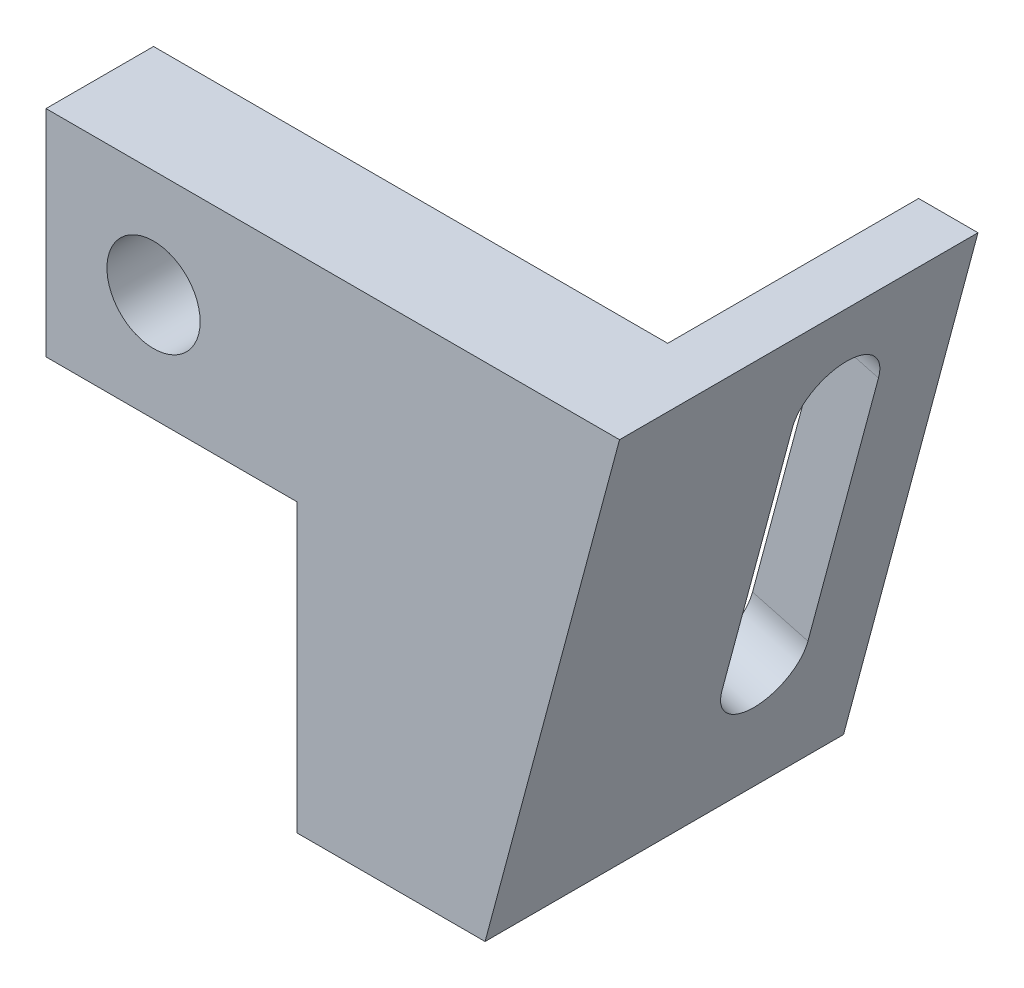
ISO-10303-21;
HEADER;
FILE_DESCRIPTION(('STEP AP214'),'2;1');
FILE_NAME('part.step','',(''),(''),'','','');
FILE_SCHEMA(('AUTOMOTIVE_DESIGN { 1 0 10303 214 1 1 1 1 }'));
ENDSEC;
DATA;
#1=APPLICATION_CONTEXT('core data for automotive mechanical design processes');
#2=APPLICATION_PROTOCOL_DEFINITION('international standard','automotive_design',2000,#1);
#3=PRODUCT_CONTEXT('',#1,'mechanical');
#4=PRODUCT('Part','Part','',(#3));
#5=PRODUCT_RELATED_PRODUCT_CATEGORY('part','',(#4));
#6=PRODUCT_DEFINITION_FORMATION('','',#4);
#7=PRODUCT_DEFINITION_CONTEXT('part definition',#1,'design');
#8=PRODUCT_DEFINITION('design','',#6,#7);
#9=PRODUCT_DEFINITION_SHAPE('','',#8);
#10=(LENGTH_UNIT() NAMED_UNIT(*) SI_UNIT(.MILLI.,.METRE.));
#11=(NAMED_UNIT(*) PLANE_ANGLE_UNIT() SI_UNIT($,.RADIAN.));
#12=(NAMED_UNIT(*) SI_UNIT($,.STERADIAN.) SOLID_ANGLE_UNIT());
#13=UNCERTAINTY_MEASURE_WITH_UNIT(LENGTH_MEASURE(1.E-05),#10,'distance_accuracy_value','');
#14=(GEOMETRIC_REPRESENTATION_CONTEXT(3) GLOBAL_UNCERTAINTY_ASSIGNED_CONTEXT((#13)) GLOBAL_UNIT_ASSIGNED_CONTEXT((#10,
#11,#12)) REPRESENTATION_CONTEXT('',''));
#15=CARTESIAN_POINT('',(0.,0.,0.));
#16=DIRECTION('',(0.,0.,1.));
#17=DIRECTION('',(1.,0.,0.));
#18=AXIS2_PLACEMENT_3D('',#15,#16,#17);
#19=CARTESIAN_POINT('',(0.,0.,0.));
#20=DIRECTION('',(0.,0.,1.));
#21=DIRECTION('',(1.,0.,0.));
#22=AXIS2_PLACEMENT_3D('',#19,#20,#21);
#23=PLANE('',#22);
#24=CARTESIAN_POINT('',(-96.6168499055209,31.5709484780107,0.));
#25=DIRECTION('',(0.,0.,1.));
#26=DIRECTION('',(1.,0.,0.));
#27=AXIS2_PLACEMENT_3D('',#24,#25,#26);
#28=CIRCLE('',#27,6.5);
#29=CARTESIAN_POINT('',(-90.1168499055209,31.5709484780107,0.));
#30=VERTEX_POINT('',#29);
#31=EDGE_CURVE('E203',#30,#30,#28,.T.);
#32=ORIENTED_EDGE('',*,*,#31,.T.);
#33=EDGE_LOOP('',(#32));
#34=FACE_BOUND('',#33,.T.);
#35=DIRECTION('',(0.258819045102525,0.965925826289067,0.));
#36=VECTOR('',#35,1.);
#37=CARTESIAN_POINT('',(-58.6555028189805,-23.4290515219893,0.));
#38=LINE('',#37,#36);
#39=CARTESIAN_POINT('',(-58.6555028189805,-23.4290515219893,0.));
#40=VERTEX_POINT('',#39);
#41=CARTESIAN_POINT('',(-39.8990593488016,46.5709484780107,0.));
#42=VERTEX_POINT('',#41);
#43=EDGE_CURVE('E145',#40,#42,#38,.T.);
#44=ORIENTED_EDGE('',*,*,#43,.F.);
#45=DIRECTION('',(1.,0.,0.));
#46=VECTOR('',#45,1.);
#47=CARTESIAN_POINT('',(-50.3732933756998,-23.4290515219893,0.));
#48=LINE('',#47,#46);
#49=CARTESIAN_POINT('',(-76.6168499055209,-23.4290515219893,0.));
#50=VERTEX_POINT('',#49);
#51=EDGE_CURVE('E217',#50,#40,#48,.T.);
#52=ORIENTED_EDGE('',*,*,#51,.F.);
#53=DIRECTION('',(0.,-1.,0.));
#54=VECTOR('',#53,1.);
#55=CARTESIAN_POINT('',(-76.6168499055209,-23.4290515219893,0.));
#56=LINE('',#55,#54);
#57=CARTESIAN_POINT('',(-76.6168499055209,16.5709484780107,0.));
#58=VERTEX_POINT('',#57);
#59=EDGE_CURVE('E241',#58,#50,#56,.T.);
#60=ORIENTED_EDGE('',*,*,#59,.F.);
#61=DIRECTION('',(1.,0.,0.));
#62=VECTOR('',#61,1.);
#63=CARTESIAN_POINT('',(-76.6168499055209,16.5709484780107,0.));
#64=LINE('',#63,#62);
#65=CARTESIAN_POINT('',(-111.616849905521,16.5709484780107,0.));
#66=VERTEX_POINT('',#65);
#67=EDGE_CURVE('E238',#66,#58,#64,.T.);
#68=ORIENTED_EDGE('',*,*,#67,.F.);
#69=DIRECTION('',(0.,-1.,0.));
#70=VECTOR('',#69,1.);
#71=CARTESIAN_POINT('',(-111.616849905521,16.5709484780107,0.));
#72=LINE('',#71,#70);
#73=CARTESIAN_POINT('',(-111.616849905521,46.5709484780107,0.));
#74=VERTEX_POINT('',#73);
#75=EDGE_CURVE('E235',#74,#66,#72,.T.);
#76=ORIENTED_EDGE('',*,*,#75,.F.);
#77=DIRECTION('',(-1.,0.,0.));
#78=VECTOR('',#77,1.);
#79=CARTESIAN_POINT('',(-111.616849905521,46.5709484780107,0.));
#80=LINE('',#79,#78);
#81=EDGE_CURVE('E208',#42,#74,#80,.T.);
#82=ORIENTED_EDGE('',*,*,#81,.F.);
#83=EDGE_LOOP('',(#44,#52,#60,#68,#76,#82));
#84=FACE_BOUND('',#83,.T.);
#85=ADVANCED_FACE('F39',(#34,#84),#23,.F.);
#86=CARTESIAN_POINT('',(0.,0.,15.));
#87=DIRECTION('',(0.,0.,1.));
#88=DIRECTION('',(1.,0.,0.));
#89=AXIS2_PLACEMENT_3D('',#86,#87,#88);
#90=PLANE('',#89);
#91=DIRECTION('',(-1.,0.,0.));
#92=VECTOR('',#91,1.);
#93=CARTESIAN_POINT('',(-111.616849905521,46.5709484780107,15.));
#94=LINE('',#93,#92);
#95=CARTESIAN_POINT('',(-31.6168499055209,46.5709484780107,15.));
#96=VERTEX_POINT('',#95);
#97=CARTESIAN_POINT('',(-111.616849905521,46.5709484780107,15.));
#98=VERTEX_POINT('',#97);
#99=EDGE_CURVE('E212',#96,#98,#94,.T.);
#100=ORIENTED_EDGE('',*,*,#99,.T.);
#101=DIRECTION('',(0.,-1.,0.));
#102=VECTOR('',#101,1.);
#103=CARTESIAN_POINT('',(-111.616849905521,16.5709484780107,15.));
#104=LINE('',#103,#102);
#105=CARTESIAN_POINT('',(-111.616849905521,16.5709484780107,15.));
#106=VERTEX_POINT('',#105);
#107=EDGE_CURVE('E216',#98,#106,#104,.T.);
#108=ORIENTED_EDGE('',*,*,#107,.T.);
#109=DIRECTION('',(1.,0.,0.));
#110=VECTOR('',#109,1.);
#111=CARTESIAN_POINT('',(-76.6168499055209,16.5709484780107,15.));
#112=LINE('',#111,#110);
#113=CARTESIAN_POINT('',(-76.6168499055209,16.5709484780107,15.));
#114=VERTEX_POINT('',#113);
#115=EDGE_CURVE('E220',#106,#114,#112,.T.);
#116=ORIENTED_EDGE('',*,*,#115,.T.);
#117=DIRECTION('',(0.,-1.,0.));
#118=VECTOR('',#117,1.);
#119=CARTESIAN_POINT('',(-76.6168499055209,-23.4290515219893,15.));
#120=LINE('',#119,#118);
#121=CARTESIAN_POINT('',(-76.6168499055209,-23.4290515219893,15.));
#122=VERTEX_POINT('',#121);
#123=EDGE_CURVE('E223',#114,#122,#120,.T.);
#124=ORIENTED_EDGE('',*,*,#123,.T.);
#125=DIRECTION('',(1.,0.,0.));
#126=VECTOR('',#125,1.);
#127=CARTESIAN_POINT('',(-50.3732933756998,-23.4290515219893,15.));
#128=LINE('',#127,#126);
#129=CARTESIAN_POINT('',(-50.3732933756998,-23.4290515219893,15.));
#130=VERTEX_POINT('',#129);
#131=EDGE_CURVE('E226',#122,#130,#128,.T.);
#132=ORIENTED_EDGE('',*,*,#131,.T.);
#133=DIRECTION('',(0.258819045102525,0.965925826289067,0.));
#134=VECTOR('',#133,1.);
#135=CARTESIAN_POINT('',(-31.6168499055209,46.5709484780107,15.));
#136=LINE('',#135,#134);
#137=EDGE_CURVE('E229',#130,#96,#136,.T.);
#138=ORIENTED_EDGE('',*,*,#137,.T.);
#139=EDGE_LOOP('',(#100,#108,#116,#124,#132,#138));
#140=FACE_BOUND('',#139,.T.);
#141=CARTESIAN_POINT('',(-96.6168499055209,31.5709484780107,15.));
#142=DIRECTION('',(0.,0.,1.));
#143=DIRECTION('',(1.,0.,0.));
#144=AXIS2_PLACEMENT_3D('',#141,#142,#143);
#145=CIRCLE('',#144,6.5);
#146=CARTESIAN_POINT('',(-90.1168499055209,31.5709484780107,15.));
#147=VERTEX_POINT('',#146);
#148=EDGE_CURVE('E204',#147,#147,#145,.T.);
#149=ORIENTED_EDGE('',*,*,#148,.F.);
#150=EDGE_LOOP('',(#149));
#151=FACE_BOUND('',#150,.T.);
#152=ADVANCED_FACE('F284',(#140,#151),#90,.T.);
#153=CARTESIAN_POINT('',(-111.616849905521,46.5709484780107,15.));
#154=DIRECTION('',(0.,-1.,0.));
#155=DIRECTION('',(0.,0.,-1.));
#156=AXIS2_PLACEMENT_3D('',#153,#154,#155);
#157=PLANE('',#156);
#158=DIRECTION('',(0.,0.,-1.));
#159=VECTOR('',#158,1.);
#160=CARTESIAN_POINT('',(-31.6168499055209,46.5709484780107,15.));
#161=LINE('',#160,#159);
#162=CARTESIAN_POINT('',(-31.6168499055209,46.5709484780107,-35.));
#163=VERTEX_POINT('',#162);
#164=EDGE_CURVE('E232',#96,#163,#161,.T.);
#165=ORIENTED_EDGE('',*,*,#164,.T.);
#166=DIRECTION('',(1.,0.,0.));
#167=VECTOR('',#166,1.);
#168=CARTESIAN_POINT('',(-39.8990593488016,46.5709484780107,-35.));
#169=LINE('',#168,#167);
#170=CARTESIAN_POINT('',(-39.8990593488016,46.5709484780107,-35.));
#171=VERTEX_POINT('',#170);
#172=EDGE_CURVE('E184',#171,#163,#169,.T.);
#173=ORIENTED_EDGE('',*,*,#172,.F.);
#174=DIRECTION('',(0.,0.,1.));
#175=VECTOR('',#174,1.);
#176=CARTESIAN_POINT('',(-39.8990593488016,46.5709484780107,-35.));
#177=LINE('',#176,#175);
#178=EDGE_CURVE('E192',#171,#42,#177,.T.);
#179=ORIENTED_EDGE('',*,*,#178,.T.);
#180=ORIENTED_EDGE('',*,*,#81,.T.);
#181=DIRECTION('',(0.,0.,-1.));
#182=VECTOR('',#181,1.);
#183=CARTESIAN_POINT('',(-111.616849905521,46.5709484780107,15.));
#184=LINE('',#183,#182);
#185=EDGE_CURVE('E11',#98,#74,#184,.T.);
#186=ORIENTED_EDGE('',*,*,#185,.F.);
#187=ORIENTED_EDGE('',*,*,#99,.F.);
#188=EDGE_LOOP('',(#165,#173,#179,#180,#186,#187));
#189=FACE_BOUND('',#188,.T.);
#190=ADVANCED_FACE('F41',(#189),#157,.F.);
#191=CARTESIAN_POINT('',(-111.616849905521,16.5709484780107,15.));
#192=DIRECTION('',(1.,0.,0.));
#193=DIRECTION('',(0.,1.,0.));
#194=AXIS2_PLACEMENT_3D('',#191,#192,#193);
#195=PLANE('',#194);
#196=ORIENTED_EDGE('',*,*,#75,.T.);
#197=DIRECTION('',(0.,0.,-1.));
#198=VECTOR('',#197,1.);
#199=CARTESIAN_POINT('',(-111.616849905521,16.5709484780107,15.));
#200=LINE('',#199,#198);
#201=EDGE_CURVE('E48',#106,#66,#200,.T.);
#202=ORIENTED_EDGE('',*,*,#201,.F.);
#203=ORIENTED_EDGE('',*,*,#107,.F.);
#204=ORIENTED_EDGE('',*,*,#185,.T.);
#205=EDGE_LOOP('',(#196,#202,#203,#204));
#206=FACE_BOUND('',#205,.T.);
#207=ADVANCED_FACE('F289',(#206),#195,.F.);
#208=CARTESIAN_POINT('',(-76.6168499055209,16.5709484780107,15.));
#209=DIRECTION('',(0.,1.,0.));
#210=DIRECTION('',(-1.,0.,0.));
#211=AXIS2_PLACEMENT_3D('',#208,#209,#210);
#212=PLANE('',#211);
#213=ORIENTED_EDGE('',*,*,#67,.T.);
#214=DIRECTION('',(0.,0.,-1.));
#215=VECTOR('',#214,1.);
#216=CARTESIAN_POINT('',(-76.6168499055209,16.5709484780107,15.));
#217=LINE('',#216,#215);
#218=EDGE_CURVE('E256',#114,#58,#217,.T.);
#219=ORIENTED_EDGE('',*,*,#218,.F.);
#220=ORIENTED_EDGE('',*,*,#115,.F.);
#221=ORIENTED_EDGE('',*,*,#201,.T.);
#222=EDGE_LOOP('',(#213,#219,#220,#221));
#223=FACE_BOUND('',#222,.T.);
#224=ADVANCED_FACE('F265',(#223),#212,.F.);
#225=CARTESIAN_POINT('',(-76.6168499055209,-23.4290515219893,15.));
#226=DIRECTION('',(1.,0.,0.));
#227=DIRECTION('',(0.,0.,-1.));
#228=AXIS2_PLACEMENT_3D('',#225,#226,#227);
#229=PLANE('',#228);
#230=ORIENTED_EDGE('',*,*,#59,.T.);
#231=DIRECTION('',(0.,0.,-1.));
#232=VECTOR('',#231,1.);
#233=CARTESIAN_POINT('',(-76.6168499055209,-23.4290515219893,15.));
#234=LINE('',#233,#232);
#235=EDGE_CURVE('E252',#122,#50,#234,.T.);
#236=ORIENTED_EDGE('',*,*,#235,.F.);
#237=ORIENTED_EDGE('',*,*,#123,.F.);
#238=ORIENTED_EDGE('',*,*,#218,.T.);
#239=EDGE_LOOP('',(#230,#236,#237,#238));
#240=FACE_BOUND('',#239,.T.);
#241=ADVANCED_FACE('F274',(#240),#229,.F.);
#242=CARTESIAN_POINT('',(-50.3732933756998,-23.4290515219893,15.));
#243=DIRECTION('',(0.,1.,0.));
#244=DIRECTION('',(-1.,0.,0.));
#245=AXIS2_PLACEMENT_3D('',#242,#243,#244);
#246=PLANE('',#245);
#247=ORIENTED_EDGE('',*,*,#51,.T.);
#248=DIRECTION('',(0.,0.,1.));
#249=VECTOR('',#248,1.);
#250=CARTESIAN_POINT('',(-58.6555028189805,-23.4290515219893,-35.));
#251=LINE('',#250,#249);
#252=CARTESIAN_POINT('',(-58.6555028189805,-23.4290515219893,-35.));
#253=VERTEX_POINT('',#252);
#254=EDGE_CURVE('E199',#253,#40,#251,.T.);
#255=ORIENTED_EDGE('',*,*,#254,.F.);
#256=DIRECTION('',(-1.,0.,0.));
#257=VECTOR('',#256,1.);
#258=CARTESIAN_POINT('',(-50.3732933756998,-23.4290515219893,-35.));
#259=LINE('',#258,#257);
#260=CARTESIAN_POINT('',(-50.3732933756998,-23.4290515219893,-35.));
#261=VERTEX_POINT('',#260);
#262=EDGE_CURVE('E177',#261,#253,#259,.T.);
#263=ORIENTED_EDGE('',*,*,#262,.F.);
#264=DIRECTION('',(0.,0.,-1.));
#265=VECTOR('',#264,1.);
#266=CARTESIAN_POINT('',(-50.3732933756998,-23.4290515219893,15.));
#267=LINE('',#266,#265);
#268=EDGE_CURVE('E249',#130,#261,#267,.T.);
#269=ORIENTED_EDGE('',*,*,#268,.F.);
#270=ORIENTED_EDGE('',*,*,#131,.F.);
#271=ORIENTED_EDGE('',*,*,#235,.T.);
#272=EDGE_LOOP('',(#247,#255,#263,#269,#270,#271));
#273=FACE_BOUND('',#272,.T.);
#274=ADVANCED_FACE('F278',(#273),#246,.F.);
#275=CARTESIAN_POINT('',(-31.6168499055209,46.5709484780107,15.));
#276=DIRECTION('',(-0.965925826289067,0.258819045102525,0.));
#277=DIRECTION('',(-0.258819045102525,-0.965925826289067,0.));
#278=AXIS2_PLACEMENT_3D('',#275,#276,#277);
#279=PLANE('',#278);
#280=DIRECTION('',(-0.258819045102525,-0.965925826289067,0.));
#281=VECTOR('',#280,1.);
#282=CARTESIAN_POINT('',(-35.4991355820588,32.0820610836747,-13.));
#283=LINE('',#282,#281);
#284=CARTESIAN_POINT('',(-35.4991355820588,32.0820610836747,-13.));
#285=VERTEX_POINT('',#284);
#286=CARTESIAN_POINT('',(-45.3342592959548,-4.62312031530984,-13.));
#287=VERTEX_POINT('',#286);
#288=EDGE_CURVE('E156',#285,#287,#283,.T.);
#289=ORIENTED_EDGE('',*,*,#288,.F.);
#290=CARTESIAN_POINT('',(-35.4991355820588,32.0820610836747,-19.));
#291=DIRECTION('',(0.965925826289067,-0.258819045102525,0.));
#292=DIRECTION('',(0.258819045102525,0.965925826289067,0.));
#293=AXIS2_PLACEMENT_3D('',#290,#291,#292);
#294=CIRCLE('',#293,6.);
#295=CARTESIAN_POINT('',(-35.4991355820588,32.0820610836747,-25.));
#296=VERTEX_POINT('',#295);
#297=EDGE_CURVE('E55',#296,#285,#294,.T.);
#298=ORIENTED_EDGE('',*,*,#297,.F.);
#299=DIRECTION('',(0.258819045102525,0.965925826289067,0.));
#300=VECTOR('',#299,1.);
#301=CARTESIAN_POINT('',(-35.4991355820588,32.0820610836747,-25.));
#302=LINE('',#301,#300);
#303=CARTESIAN_POINT('',(-45.3342592959548,-4.62312031530984,-25.));
#304=VERTEX_POINT('',#303);
#305=EDGE_CURVE('E138',#304,#296,#302,.T.);
#306=ORIENTED_EDGE('',*,*,#305,.F.);
#307=CARTESIAN_POINT('',(-45.3342592959548,-4.62312031530984,-19.));
#308=DIRECTION('',(0.965925826289067,-0.258819045102525,0.));
#309=DIRECTION('',(0.258819045102525,0.965925826289067,0.));
#310=AXIS2_PLACEMENT_3D('',#307,#308,#309);
#311=CIRCLE('',#310,6.);
#312=EDGE_CURVE('E163',#287,#304,#311,.T.);
#313=ORIENTED_EDGE('',*,*,#312,.F.);
#314=EDGE_LOOP('',(#289,#298,#306,#313));
#315=FACE_BOUND('',#314,.T.);
#316=ORIENTED_EDGE('',*,*,#268,.T.);
#317=DIRECTION('',(-0.258819045102525,-0.965925826289067,0.));
#318=VECTOR('',#317,1.);
#319=CARTESIAN_POINT('',(-31.6168499055209,46.5709484780107,-35.));
#320=LINE('',#319,#318);
#321=EDGE_CURVE('E188',#163,#261,#320,.T.);
#322=ORIENTED_EDGE('',*,*,#321,.F.);
#323=ORIENTED_EDGE('',*,*,#164,.F.);
#324=ORIENTED_EDGE('',*,*,#137,.F.);
#325=EDGE_LOOP('',(#316,#322,#323,#324));
#326=FACE_BOUND('',#325,.T.);
#327=ADVANCED_FACE('F297',(#315,#326),#279,.F.);
#328=CARTESIAN_POINT('',(-96.6168499055209,31.5709484780107,15.));
#329=DIRECTION('',(0.,0.,-1.));
#330=DIRECTION('',(-1.,0.,0.));
#331=AXIS2_PLACEMENT_3D('',#328,#329,#330);
#332=CYLINDRICAL_SURFACE('',#331,6.5);
#333=ORIENTED_EDGE('',*,*,#148,.T.);
#334=EDGE_LOOP('',(#333));
#335=FACE_BOUND('',#334,.T.);
#336=ORIENTED_EDGE('',*,*,#31,.F.);
#337=EDGE_LOOP('',(#336));
#338=FACE_BOUND('',#337,.T.);
#339=ADVANCED_FACE('F299',(#335,#338),#332,.F.);
#340=CARTESIAN_POINT('',(-58.6555028189805,-23.4290515219893,-35.));
#341=DIRECTION('',(0.965925826289067,-0.258819045102525,0.));
#342=DIRECTION('',(0.258819045102525,0.965925826289067,0.));
#343=AXIS2_PLACEMENT_3D('',#340,#341,#342);
#344=PLANE('',#343);
#345=DIRECTION('',(-0.258819045102525,-0.965925826289067,0.));
#346=VECTOR('',#345,1.);
#347=CARTESIAN_POINT('',(-43.2265421923713,34.1526134444949,-25.));
#348=LINE('',#347,#346);
#349=CARTESIAN_POINT('',(-43.2265421923713,34.1526134444949,-25.));
#350=VERTEX_POINT('',#349);
#351=CARTESIAN_POINT('',(-53.0616659062673,-2.55256795448965,-25.));
#352=VERTEX_POINT('',#351);
#353=EDGE_CURVE('E151',#350,#352,#348,.T.);
#354=ORIENTED_EDGE('',*,*,#353,.F.);
#355=CARTESIAN_POINT('',(-43.2265421923713,34.1526134444949,-19.));
#356=DIRECTION('',(0.965925826289067,-0.258819045102525,0.));
#357=DIRECTION('',(0.258819045102525,0.965925826289067,0.));
#358=AXIS2_PLACEMENT_3D('',#355,#356,#357);
#359=CIRCLE('',#358,6.);
#360=CARTESIAN_POINT('',(-43.2265421923713,34.1526134444949,-13.));
#361=VERTEX_POINT('',#360);
#362=EDGE_CURVE('E131',#361,#350,#359,.F.);
#363=ORIENTED_EDGE('',*,*,#362,.F.);
#364=DIRECTION('',(0.258819045102525,0.965925826289067,0.));
#365=VECTOR('',#364,1.);
#366=CARTESIAN_POINT('',(-43.2265421923713,34.1526134444949,-13.));
#367=LINE('',#366,#365);
#368=CARTESIAN_POINT('',(-53.0616659062673,-2.55256795448963,-13.));
#369=VERTEX_POINT('',#368);
#370=EDGE_CURVE('E141',#369,#361,#367,.T.);
#371=ORIENTED_EDGE('',*,*,#370,.F.);
#372=CARTESIAN_POINT('',(-53.0616659062673,-2.55256795448965,-19.));
#373=DIRECTION('',(0.965925826289067,-0.258819045102525,0.));
#374=DIRECTION('',(0.258819045102525,0.965925826289067,0.));
#375=AXIS2_PLACEMENT_3D('',#372,#373,#374);
#376=CIRCLE('',#375,6.);
#377=EDGE_CURVE('E63',#352,#369,#376,.F.);
#378=ORIENTED_EDGE('',*,*,#377,.F.);
#379=EDGE_LOOP('',(#354,#363,#371,#378));
#380=FACE_BOUND('',#379,.T.);
#381=ORIENTED_EDGE('',*,*,#43,.T.);
#382=ORIENTED_EDGE('',*,*,#178,.F.);
#383=DIRECTION('',(0.258819045102525,0.965925826289067,0.));
#384=VECTOR('',#383,1.);
#385=CARTESIAN_POINT('',(-58.6555028189805,-23.4290515219893,-35.));
#386=LINE('',#385,#384);
#387=EDGE_CURVE('E181',#253,#171,#386,.T.);
#388=ORIENTED_EDGE('',*,*,#387,.F.);
#389=ORIENTED_EDGE('',*,*,#254,.T.);
#390=EDGE_LOOP('',(#381,#382,#388,#389));
#391=FACE_BOUND('',#390,.T.);
#392=ADVANCED_FACE('F148',(#380,#391),#344,.F.);
#393=CARTESIAN_POINT('',(0.,0.,-35.));
#394=DIRECTION('',(0.,0.,-1.));
#395=DIRECTION('',(-1.,0.,0.));
#396=AXIS2_PLACEMENT_3D('',#393,#394,#395);
#397=PLANE('',#396);
#398=ORIENTED_EDGE('',*,*,#262,.T.);
#399=ORIENTED_EDGE('',*,*,#387,.T.);
#400=ORIENTED_EDGE('',*,*,#172,.T.);
#401=ORIENTED_EDGE('',*,*,#321,.T.);
#402=EDGE_LOOP('',(#398,#399,#400,#401));
#403=FACE_BOUND('',#402,.T.);
#404=ADVANCED_FACE('F294',(#403),#397,.T.);
#405=CARTESIAN_POINT('',(-110.141334746138,52.0823780709731,-19.));
#406=DIRECTION('',(0.965925826289067,-0.258819045102525,0.));
#407=DIRECTION('',(0.258819045102525,0.965925826289067,0.));
#408=AXIS2_PLACEMENT_3D('',#405,#406,#407);
#409=CYLINDRICAL_SURFACE('',#408,6.);
#410=ORIENTED_EDGE('',*,*,#362,.T.);
#411=DIRECTION('',(0.965925826289067,-0.258819045102525,0.));
#412=VECTOR('',#411,1.);
#413=CARTESIAN_POINT('',(-110.141334746138,52.0823780709731,-25.));
#414=LINE('',#413,#412);
#415=EDGE_CURVE('E146',#350,#296,#414,.T.);
#416=ORIENTED_EDGE('',*,*,#415,.T.);
#417=ORIENTED_EDGE('',*,*,#297,.T.);
#418=DIRECTION('',(0.965925826289067,-0.258819045102525,0.));
#419=VECTOR('',#418,1.);
#420=CARTESIAN_POINT('',(-110.141334746138,52.0823780709731,-13.));
#421=LINE('',#420,#419);
#422=EDGE_CURVE('E127',#361,#285,#421,.T.);
#423=ORIENTED_EDGE('',*,*,#422,.F.);
#424=EDGE_LOOP('',(#410,#416,#417,#423));
#425=FACE_BOUND('',#424,.T.);
#426=ADVANCED_FACE('F129',(#425),#409,.F.);
#427=CARTESIAN_POINT('',(-110.141334746138,52.0823780709731,-25.));
#428=DIRECTION('',(0.,0.,-1.));
#429=DIRECTION('',(-1.,0.,0.));
#430=AXIS2_PLACEMENT_3D('',#427,#428,#429);
#431=PLANE('',#430);
#432=ORIENTED_EDGE('',*,*,#353,.T.);
#433=DIRECTION('',(0.965925826289067,-0.258819045102525,0.));
#434=VECTOR('',#433,1.);
#435=CARTESIAN_POINT('',(-119.976458460034,15.3771966719886,-25.));
#436=LINE('',#435,#434);
#437=EDGE_CURVE('E172',#352,#304,#436,.T.);
#438=ORIENTED_EDGE('',*,*,#437,.T.);
#439=ORIENTED_EDGE('',*,*,#305,.T.);
#440=ORIENTED_EDGE('',*,*,#415,.F.);
#441=EDGE_LOOP('',(#432,#438,#439,#440));
#442=FACE_BOUND('',#441,.T.);
#443=ADVANCED_FACE('F323',(#442),#431,.F.);
#444=CARTESIAN_POINT('',(-119.976458460034,15.3771966719886,-19.));
#445=DIRECTION('',(0.965925826289067,-0.258819045102525,0.));
#446=DIRECTION('',(0.258819045102525,0.965925826289067,0.));
#447=AXIS2_PLACEMENT_3D('',#444,#445,#446);
#448=CYLINDRICAL_SURFACE('',#447,6.);
#449=ORIENTED_EDGE('',*,*,#377,.T.);
#450=DIRECTION('',(0.965925826289067,-0.258819045102525,0.));
#451=VECTOR('',#450,1.);
#452=CARTESIAN_POINT('',(-119.976458460034,15.3771966719886,-13.));
#453=LINE('',#452,#451);
#454=EDGE_CURVE('E137',#369,#287,#453,.T.);
#455=ORIENTED_EDGE('',*,*,#454,.T.);
#456=ORIENTED_EDGE('',*,*,#312,.T.);
#457=ORIENTED_EDGE('',*,*,#437,.F.);
#458=EDGE_LOOP('',(#449,#455,#456,#457));
#459=FACE_BOUND('',#458,.T.);
#460=ADVANCED_FACE('F326',(#459),#448,.F.);
#461=CARTESIAN_POINT('',(-110.141334746138,52.0823780709731,-13.));
#462=DIRECTION('',(0.,0.,1.));
#463=DIRECTION('',(1.,0.,0.));
#464=AXIS2_PLACEMENT_3D('',#461,#462,#463);
#465=PLANE('',#464);
#466=ORIENTED_EDGE('',*,*,#370,.T.);
#467=ORIENTED_EDGE('',*,*,#422,.T.);
#468=ORIENTED_EDGE('',*,*,#288,.T.);
#469=ORIENTED_EDGE('',*,*,#454,.F.);
#470=EDGE_LOOP('',(#466,#467,#468,#469));
#471=FACE_BOUND('',#470,.T.);
#472=ADVANCED_FACE('F142',(#471),#465,.F.);
#473=CLOSED_SHELL('',(#85,#152,#190,#207,#224,#241,#274,#327,#339,#392,#404,#426,#443,#460,#472));
#474=MANIFOLD_SOLID_BREP('B2',#473);
#475=ADVANCED_BREP_SHAPE_REPRESENTATION('',(#18,#474),#14);
#476=SHAPE_DEFINITION_REPRESENTATION(#9,#475);
ENDSEC;
END-ISO-10303-21;
